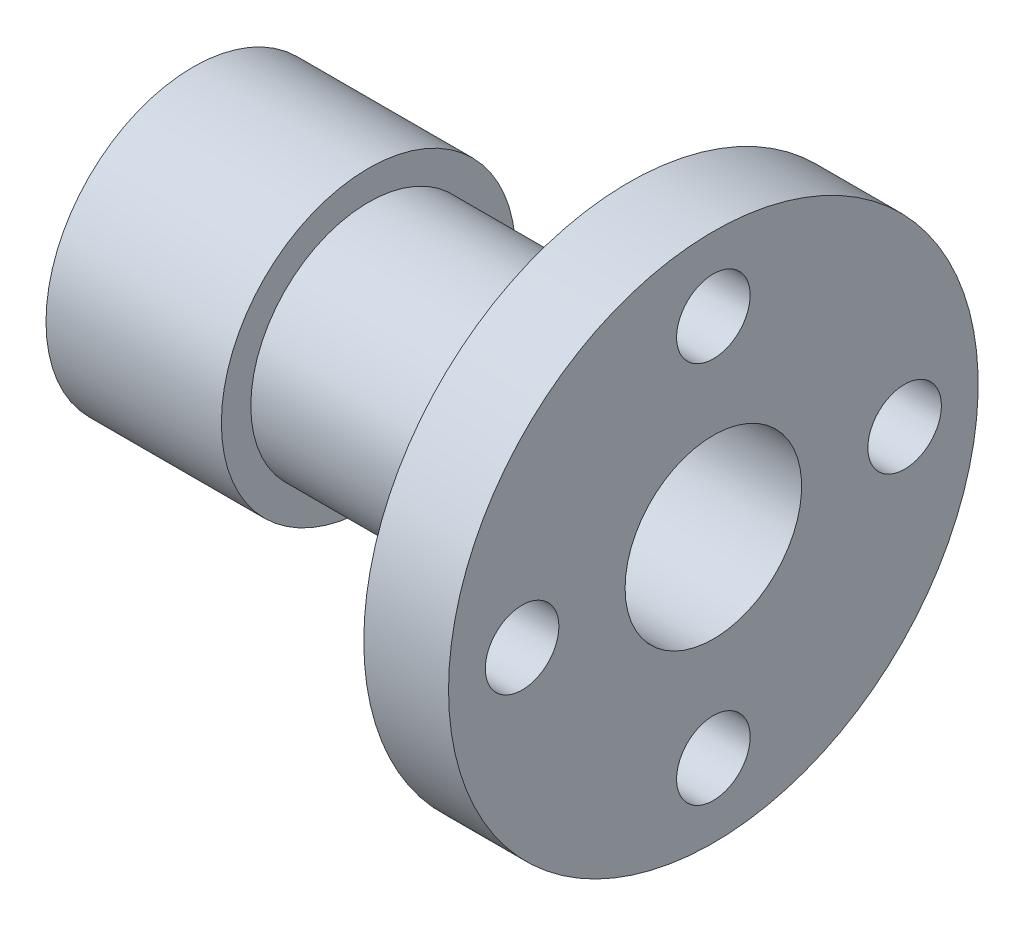
ISO-10303-21;
HEADER;
FILE_DESCRIPTION(('STEP AP214'),'2;1');
FILE_NAME('part.step','',(''),(''),'','','');
FILE_SCHEMA(('AUTOMOTIVE_DESIGN { 1 0 10303 214 1 1 1 1 }'));
ENDSEC;
DATA;
#1=APPLICATION_CONTEXT('core data for automotive mechanical design processes');
#2=APPLICATION_PROTOCOL_DEFINITION('international standard','automotive_design',2000,#1);
#3=PRODUCT_CONTEXT('',#1,'mechanical');
#4=PRODUCT('Part','Part','',(#3));
#5=PRODUCT_RELATED_PRODUCT_CATEGORY('part','',(#4));
#6=PRODUCT_DEFINITION_FORMATION('','',#4);
#7=PRODUCT_DEFINITION_CONTEXT('part definition',#1,'design');
#8=PRODUCT_DEFINITION('design','',#6,#7);
#9=PRODUCT_DEFINITION_SHAPE('','',#8);
#10=(LENGTH_UNIT() NAMED_UNIT(*) SI_UNIT(.MILLI.,.METRE.));
#11=(NAMED_UNIT(*) PLANE_ANGLE_UNIT() SI_UNIT($,.RADIAN.));
#12=(NAMED_UNIT(*) SI_UNIT($,.STERADIAN.) SOLID_ANGLE_UNIT());
#13=UNCERTAINTY_MEASURE_WITH_UNIT(LENGTH_MEASURE(1.E-05),#10,'distance_accuracy_value','');
#14=(GEOMETRIC_REPRESENTATION_CONTEXT(3) GLOBAL_UNCERTAINTY_ASSIGNED_CONTEXT((#13)) GLOBAL_UNIT_ASSIGNED_CONTEXT((#10,
#11,#12)) REPRESENTATION_CONTEXT('',''));
#15=CARTESIAN_POINT('',(0.,0.,0.));
#16=DIRECTION('',(0.,0.,1.));
#17=DIRECTION('',(1.,0.,0.));
#18=AXIS2_PLACEMENT_3D('',#15,#16,#17);
#19=CARTESIAN_POINT('',(-44.2,0.,-19.));
#20=DIRECTION('',(1.,0.,0.));
#21=DIRECTION('',(0.,0.,-1.));
#22=AXIS2_PLACEMENT_3D('',#19,#20,#21);
#23=PLANE('',#22);
#24=CARTESIAN_POINT('',(-44.2,0.,0.));
#25=DIRECTION('',(-1.,0.,0.));
#26=DIRECTION('',(0.,0.,1.));
#27=AXIS2_PLACEMENT_3D('',#24,#25,#26);
#28=CIRCLE('',#27,19.);
#29=CARTESIAN_POINT('',(-44.2,0.,19.));
#30=VERTEX_POINT('',#29);
#31=EDGE_CURVE('E78',#30,#30,#28,.T.);
#32=ORIENTED_EDGE('',*,*,#31,.F.);
#33=EDGE_LOOP('',(#32));
#34=FACE_BOUND('',#33,.T.);
#35=CARTESIAN_POINT('',(-44.2,0.,0.));
#36=DIRECTION('',(-1.,0.,0.));
#37=DIRECTION('',(0.,0.,1.));
#38=AXIS2_PLACEMENT_3D('',#35,#36,#37);
#39=CIRCLE('',#38,25.);
#40=CARTESIAN_POINT('',(-44.2,0.,25.));
#41=VERTEX_POINT('',#40);
#42=EDGE_CURVE('E12',#41,#41,#39,.T.);
#43=ORIENTED_EDGE('',*,*,#42,.T.);
#44=EDGE_LOOP('',(#43));
#45=FACE_BOUND('',#44,.T.);
#46=ADVANCED_FACE('F44',(#34,#45),#23,.F.);
#47=CARTESIAN_POINT('',(-44.2,0.,0.));
#48=DIRECTION('',(-1.,0.,0.));
#49=DIRECTION('',(0.,0.,1.));
#50=AXIS2_PLACEMENT_3D('',#47,#48,#49);
#51=CYLINDRICAL_SURFACE('',#50,25.);
#52=ORIENTED_EDGE('',*,*,#42,.F.);
#53=EDGE_LOOP('',(#52));
#54=FACE_BOUND('',#53,.T.);
#55=CARTESIAN_POINT('',(-14.4,0.,0.));
#56=DIRECTION('',(-1.,0.,0.));
#57=DIRECTION('',(0.,0.,1.));
#58=AXIS2_PLACEMENT_3D('',#55,#56,#57);
#59=CIRCLE('',#58,25.);
#60=CARTESIAN_POINT('',(-14.4,0.,25.));
#61=VERTEX_POINT('',#60);
#62=EDGE_CURVE('E50',#61,#61,#59,.T.);
#63=ORIENTED_EDGE('',*,*,#62,.T.);
#64=EDGE_LOOP('',(#63));
#65=FACE_BOUND('',#64,.T.);
#66=ADVANCED_FACE('F144',(#54,#65),#51,.T.);
#67=CARTESIAN_POINT('',(-14.4,0.,-25.));
#68=DIRECTION('',(-1.,0.,0.));
#69=DIRECTION('',(0.,0.,1.));
#70=AXIS2_PLACEMENT_3D('',#67,#68,#69);
#71=PLANE('',#70);
#72=ORIENTED_EDGE('',*,*,#62,.F.);
#73=EDGE_LOOP('',(#72));
#74=FACE_BOUND('',#73,.T.);
#75=CARTESIAN_POINT('',(-14.4,0.,0.));
#76=DIRECTION('',(-1.,0.,0.));
#77=DIRECTION('',(0.,0.,1.));
#78=AXIS2_PLACEMENT_3D('',#75,#76,#77);
#79=CIRCLE('',#78,20.);
#80=CARTESIAN_POINT('',(-14.4,0.,20.));
#81=VERTEX_POINT('',#80);
#82=EDGE_CURVE('E54',#81,#81,#79,.T.);
#83=ORIENTED_EDGE('',*,*,#82,.T.);
#84=EDGE_LOOP('',(#83));
#85=FACE_BOUND('',#84,.T.);
#86=ADVANCED_FACE('F148',(#74,#85),#71,.F.);
#87=CARTESIAN_POINT('',(-44.2,0.,0.));
#88=DIRECTION('',(-1.,0.,0.));
#89=DIRECTION('',(0.,0.,1.));
#90=AXIS2_PLACEMENT_3D('',#87,#88,#89);
#91=CYLINDRICAL_SURFACE('',#90,20.);
#92=ORIENTED_EDGE('',*,*,#82,.F.);
#93=EDGE_LOOP('',(#92));
#94=FACE_BOUND('',#93,.T.);
#95=CARTESIAN_POINT('',(29.8,0.,0.));
#96=DIRECTION('',(-1.,0.,0.));
#97=DIRECTION('',(0.,0.,1.));
#98=AXIS2_PLACEMENT_3D('',#95,#96,#97);
#99=CIRCLE('',#98,20.);
#100=CARTESIAN_POINT('',(29.8,0.,20.));
#101=VERTEX_POINT('',#100);
#102=EDGE_CURVE('E58',#101,#101,#99,.T.);
#103=ORIENTED_EDGE('',*,*,#102,.T.);
#104=EDGE_LOOP('',(#103));
#105=FACE_BOUND('',#104,.T.);
#106=ADVANCED_FACE('F153',(#94,#105),#91,.T.);
#107=CARTESIAN_POINT('',(29.8,0.,-20.));
#108=DIRECTION('',(1.,0.,0.));
#109=DIRECTION('',(0.,0.,-1.));
#110=AXIS2_PLACEMENT_3D('',#107,#108,#109);
#111=PLANE('',#110);
#112=CARTESIAN_POINT('',(29.8,32.5,0.));
#113=DIRECTION('',(1.,0.,0.));
#114=DIRECTION('',(0.,0.,-1.));
#115=AXIS2_PLACEMENT_3D('',#112,#113,#114);
#116=CIRCLE('',#115,6.25);
#117=CARTESIAN_POINT('',(29.8,32.5,-6.25000000000001));
#118=VERTEX_POINT('',#117);
#119=EDGE_CURVE('E81',#118,#118,#116,.T.);
#120=ORIENTED_EDGE('',*,*,#119,.T.);
#121=EDGE_LOOP('',(#120));
#122=FACE_BOUND('',#121,.T.);
#123=CARTESIAN_POINT('',(29.8,9.19725454390901E-13,-32.5000000000009));
#124=DIRECTION('',(1.,0.,0.));
#125=DIRECTION('',(0.,0.,-1.));
#126=AXIS2_PLACEMENT_3D('',#123,#124,#125);
#127=CIRCLE('',#126,6.25000000000073);
#128=CARTESIAN_POINT('',(29.8,9.19725454390901E-13,-38.7500000000017));
#129=VERTEX_POINT('',#128);
#130=EDGE_CURVE('E84',#129,#129,#127,.T.);
#131=ORIENTED_EDGE('',*,*,#130,.T.);
#132=EDGE_LOOP('',(#131));
#133=FACE_BOUND('',#132,.T.);
#134=CARTESIAN_POINT('',(29.8,-32.5,-1.84645588847293E-12));
#135=DIRECTION('',(1.,0.,0.));
#136=DIRECTION('',(0.,0.,-1.));
#137=AXIS2_PLACEMENT_3D('',#134,#135,#136);
#138=CIRCLE('',#137,6.25000000000198);
#139=CARTESIAN_POINT('',(29.8,-32.5,-6.25000000000383));
#140=VERTEX_POINT('',#139);
#141=EDGE_CURVE('E87',#140,#140,#138,.T.);
#142=ORIENTED_EDGE('',*,*,#141,.T.);
#143=EDGE_LOOP('',(#142));
#144=FACE_BOUND('',#143,.T.);
#145=CARTESIAN_POINT('',(29.8,-9.2370555648813E-13,32.4999999999991));
#146=DIRECTION('',(1.,0.,0.));
#147=DIRECTION('',(0.,0.,-1.));
#148=AXIS2_PLACEMENT_3D('',#145,#146,#147);
#149=CIRCLE('',#148,6.25000000000148);
#150=CARTESIAN_POINT('',(29.8,-9.2370555648813E-13,26.2499999999976));
#151=VERTEX_POINT('',#150);
#152=EDGE_CURVE('E90',#151,#151,#149,.T.);
#153=ORIENTED_EDGE('',*,*,#152,.T.);
#154=EDGE_LOOP('',(#153));
#155=FACE_BOUND('',#154,.T.);
#156=ORIENTED_EDGE('',*,*,#102,.F.);
#157=EDGE_LOOP('',(#156));
#158=FACE_BOUND('',#157,.T.);
#159=CARTESIAN_POINT('',(29.8,0.,0.));
#160=DIRECTION('',(-1.,0.,0.));
#161=DIRECTION('',(0.,0.,1.));
#162=AXIS2_PLACEMENT_3D('',#159,#160,#161);
#163=CIRCLE('',#162,45.);
#164=CARTESIAN_POINT('',(29.8,0.,45.));
#165=VERTEX_POINT('',#164);
#166=EDGE_CURVE('E63',#165,#165,#163,.T.);
#167=ORIENTED_EDGE('',*,*,#166,.T.);
#168=EDGE_LOOP('',(#167));
#169=FACE_BOUND('',#168,.T.);
#170=ADVANCED_FACE('F159',(#122,#133,#144,#155,#158,#169),#111,.F.);
#171=CARTESIAN_POINT('',(-44.2,0.,0.));
#172=DIRECTION('',(-1.,0.,0.));
#173=DIRECTION('',(0.,0.,1.));
#174=AXIS2_PLACEMENT_3D('',#171,#172,#173);
#175=CYLINDRICAL_SURFACE('',#174,45.);
#176=ORIENTED_EDGE('',*,*,#166,.F.);
#177=EDGE_LOOP('',(#176));
#178=FACE_BOUND('',#177,.T.);
#179=CARTESIAN_POINT('',(44.2,0.,0.));
#180=DIRECTION('',(-1.,0.,0.));
#181=DIRECTION('',(0.,0.,1.));
#182=AXIS2_PLACEMENT_3D('',#179,#180,#181);
#183=CIRCLE('',#182,45.);
#184=CARTESIAN_POINT('',(44.2,0.,45.));
#185=VERTEX_POINT('',#184);
#186=EDGE_CURVE('E66',#185,#185,#183,.T.);
#187=ORIENTED_EDGE('',*,*,#186,.T.);
#188=EDGE_LOOP('',(#187));
#189=FACE_BOUND('',#188,.T.);
#190=ADVANCED_FACE('F113',(#178,#189),#175,.T.);
#191=CARTESIAN_POINT('',(44.2,0.,-45.));
#192=DIRECTION('',(-1.,0.,0.));
#193=DIRECTION('',(0.,0.,1.));
#194=AXIS2_PLACEMENT_3D('',#191,#192,#193);
#195=PLANE('',#194);
#196=CARTESIAN_POINT('',(44.2,32.5,0.));
#197=DIRECTION('',(1.,0.,0.));
#198=DIRECTION('',(0.,0.,-1.));
#199=AXIS2_PLACEMENT_3D('',#196,#197,#198);
#200=CIRCLE('',#199,6.25);
#201=CARTESIAN_POINT('',(44.2,32.5,-6.25000000000001));
#202=VERTEX_POINT('',#201);
#203=EDGE_CURVE('E93',#202,#202,#200,.T.);
#204=ORIENTED_EDGE('',*,*,#203,.F.);
#205=EDGE_LOOP('',(#204));
#206=FACE_BOUND('',#205,.T.);
#207=CARTESIAN_POINT('',(44.2,9.19725454390901E-13,-32.5000000000009));
#208=DIRECTION('',(1.,0.,0.));
#209=DIRECTION('',(0.,0.,-1.));
#210=AXIS2_PLACEMENT_3D('',#207,#208,#209);
#211=CIRCLE('',#210,6.25000000000073);
#212=CARTESIAN_POINT('',(44.2,9.19725454390901E-13,-38.7500000000017));
#213=VERTEX_POINT('',#212);
#214=EDGE_CURVE('E100',#213,#213,#211,.T.);
#215=ORIENTED_EDGE('',*,*,#214,.F.);
#216=EDGE_LOOP('',(#215));
#217=FACE_BOUND('',#216,.T.);
#218=CARTESIAN_POINT('',(44.2,-32.5,-1.84910112555908E-12));
#219=DIRECTION('',(1.,0.,0.));
#220=DIRECTION('',(0.,0.,-1.));
#221=AXIS2_PLACEMENT_3D('',#218,#219,#220);
#222=CIRCLE('',#221,6.25000000000198);
#223=CARTESIAN_POINT('',(44.2,-32.5,-6.25000000000383));
#224=VERTEX_POINT('',#223);
#225=EDGE_CURVE('E97',#224,#224,#222,.T.);
#226=ORIENTED_EDGE('',*,*,#225,.F.);
#227=EDGE_LOOP('',(#226));
#228=FACE_BOUND('',#227,.T.);
#229=CARTESIAN_POINT('',(44.2,-9.2370555648813E-13,32.4999999999991));
#230=DIRECTION('',(1.,0.,0.));
#231=DIRECTION('',(0.,0.,-1.));
#232=AXIS2_PLACEMENT_3D('',#229,#230,#231);
#233=CIRCLE('',#232,6.25000000000148);
#234=CARTESIAN_POINT('',(44.2,-9.2370555648813E-13,26.2499999999976));
#235=VERTEX_POINT('',#234);
#236=EDGE_CURVE('E94',#235,#235,#233,.T.);
#237=ORIENTED_EDGE('',*,*,#236,.F.);
#238=EDGE_LOOP('',(#237));
#239=FACE_BOUND('',#238,.T.);
#240=ORIENTED_EDGE('',*,*,#186,.F.);
#241=EDGE_LOOP('',(#240));
#242=FACE_BOUND('',#241,.T.);
#243=CARTESIAN_POINT('',(44.2,0.,0.));
#244=DIRECTION('',(-1.,0.,0.));
#245=DIRECTION('',(0.,0.,1.));
#246=AXIS2_PLACEMENT_3D('',#243,#244,#245);
#247=CIRCLE('',#246,15.);
#248=CARTESIAN_POINT('',(44.2,0.,15.));
#249=VERTEX_POINT('',#248);
#250=EDGE_CURVE('E69',#249,#249,#247,.T.);
#251=ORIENTED_EDGE('',*,*,#250,.T.);
#252=EDGE_LOOP('',(#251));
#253=FACE_BOUND('',#252,.T.);
#254=ADVANCED_FACE('F109',(#206,#217,#228,#239,#242,#253),#195,.F.);
#255=CARTESIAN_POINT('',(-44.2,0.,0.));
#256=DIRECTION('',(-1.,0.,0.));
#257=DIRECTION('',(0.,0.,1.));
#258=AXIS2_PLACEMENT_3D('',#255,#256,#257);
#259=CYLINDRICAL_SURFACE('',#258,15.);
#260=ORIENTED_EDGE('',*,*,#250,.F.);
#261=EDGE_LOOP('',(#260));
#262=FACE_BOUND('',#261,.T.);
#263=CARTESIAN_POINT('',(-20.4,0.,0.));
#264=DIRECTION('',(-1.,0.,0.));
#265=DIRECTION('',(0.,0.,1.));
#266=AXIS2_PLACEMENT_3D('',#263,#264,#265);
#267=CIRCLE('',#266,15.);
#268=CARTESIAN_POINT('',(-20.4,0.,15.));
#269=VERTEX_POINT('',#268);
#270=EDGE_CURVE('E72',#269,#269,#267,.T.);
#271=ORIENTED_EDGE('',*,*,#270,.T.);
#272=EDGE_LOOP('',(#271));
#273=FACE_BOUND('',#272,.T.);
#274=ADVANCED_FACE('F112',(#262,#273),#259,.F.);
#275=CARTESIAN_POINT('',(-20.2,0.,0.));
#276=DIRECTION('',(1.,0.,0.));
#277=DIRECTION('',(0.,0.,-1.));
#278=AXIS2_PLACEMENT_3D('',#275,#276,#277);
#279=CONICAL_SURFACE('',#278,19.,1.52083793107296);
#280=ORIENTED_EDGE('',*,*,#270,.F.);
#281=EDGE_LOOP('',(#280));
#282=FACE_BOUND('',#281,.T.);
#283=CARTESIAN_POINT('',(-20.2,0.,0.));
#284=DIRECTION('',(-1.,0.,0.));
#285=DIRECTION('',(0.,0.,1.));
#286=AXIS2_PLACEMENT_3D('',#283,#284,#285);
#287=CIRCLE('',#286,19.);
#288=CARTESIAN_POINT('',(-20.2,0.,19.));
#289=VERTEX_POINT('',#288);
#290=EDGE_CURVE('E75',#289,#289,#287,.T.);
#291=ORIENTED_EDGE('',*,*,#290,.T.);
#292=EDGE_LOOP('',(#291));
#293=FACE_BOUND('',#292,.T.);
#294=ADVANCED_FACE('F127',(#282,#293),#279,.T.);
#295=CARTESIAN_POINT('',(-44.2,0.,0.));
#296=DIRECTION('',(-1.,0.,0.));
#297=DIRECTION('',(0.,0.,1.));
#298=AXIS2_PLACEMENT_3D('',#295,#296,#297);
#299=CYLINDRICAL_SURFACE('',#298,19.);
#300=ORIENTED_EDGE('',*,*,#290,.F.);
#301=EDGE_LOOP('',(#300));
#302=FACE_BOUND('',#301,.T.);
#303=ORIENTED_EDGE('',*,*,#31,.T.);
#304=EDGE_LOOP('',(#303));
#305=FACE_BOUND('',#304,.T.);
#306=ADVANCED_FACE('F133',(#302,#305),#299,.F.);
#307=CARTESIAN_POINT('',(-44.2,-9.2370555648813E-13,32.4999999999991));
#308=DIRECTION('',(1.,0.,0.));
#309=DIRECTION('',(0.,0.,-1.));
#310=AXIS2_PLACEMENT_3D('',#307,#308,#309);
#311=CYLINDRICAL_SURFACE('',#310,6.25000000000148);
#312=ORIENTED_EDGE('',*,*,#236,.T.);
#313=EDGE_LOOP('',(#312));
#314=FACE_BOUND('',#313,.T.);
#315=ORIENTED_EDGE('',*,*,#152,.F.);
#316=EDGE_LOOP('',(#315));
#317=FACE_BOUND('',#316,.T.);
#318=ADVANCED_FACE('F139',(#314,#317),#311,.F.);
#319=CARTESIAN_POINT('',(-44.2,-32.5,-1.83286230900239E-12));
#320=DIRECTION('',(1.,0.,0.));
#321=DIRECTION('',(0.,0.,-1.));
#322=AXIS2_PLACEMENT_3D('',#319,#320,#321);
#323=CYLINDRICAL_SURFACE('',#322,6.25000000000198);
#324=ORIENTED_EDGE('',*,*,#225,.T.);
#325=EDGE_LOOP('',(#324));
#326=FACE_BOUND('',#325,.T.);
#327=ORIENTED_EDGE('',*,*,#141,.F.);
#328=EDGE_LOOP('',(#327));
#329=FACE_BOUND('',#328,.T.);
#330=ADVANCED_FACE('F169',(#326,#329),#323,.F.);
#331=CARTESIAN_POINT('',(-44.2,9.19725454390901E-13,-32.5000000000009));
#332=DIRECTION('',(1.,0.,0.));
#333=DIRECTION('',(0.,0.,-1.));
#334=AXIS2_PLACEMENT_3D('',#331,#332,#333);
#335=CYLINDRICAL_SURFACE('',#334,6.25000000000073);
#336=ORIENTED_EDGE('',*,*,#214,.T.);
#337=EDGE_LOOP('',(#336));
#338=FACE_BOUND('',#337,.T.);
#339=ORIENTED_EDGE('',*,*,#130,.F.);
#340=EDGE_LOOP('',(#339));
#341=FACE_BOUND('',#340,.T.);
#342=ADVANCED_FACE('F173',(#338,#341),#335,.F.);
#343=CARTESIAN_POINT('',(-44.2,32.5,0.));
#344=DIRECTION('',(1.,0.,0.));
#345=DIRECTION('',(0.,0.,-1.));
#346=AXIS2_PLACEMENT_3D('',#343,#344,#345);
#347=CYLINDRICAL_SURFACE('',#346,6.25);
#348=ORIENTED_EDGE('',*,*,#203,.T.);
#349=EDGE_LOOP('',(#348));
#350=FACE_BOUND('',#349,.T.);
#351=ORIENTED_EDGE('',*,*,#119,.F.);
#352=EDGE_LOOP('',(#351));
#353=FACE_BOUND('',#352,.T.);
#354=ADVANCED_FACE('F106',(#350,#353),#347,.F.);
#355=CLOSED_SHELL('',(#46,#66,#86,#106,#170,#190,#254,#274,#294,#306,#318,#330,#342,#354));
#356=MANIFOLD_SOLID_BREP('B2',#355);
#357=ADVANCED_BREP_SHAPE_REPRESENTATION('',(#18,#356),#14);
#358=SHAPE_DEFINITION_REPRESENTATION(#9,#357);
ENDSEC;
END-ISO-10303-21;
